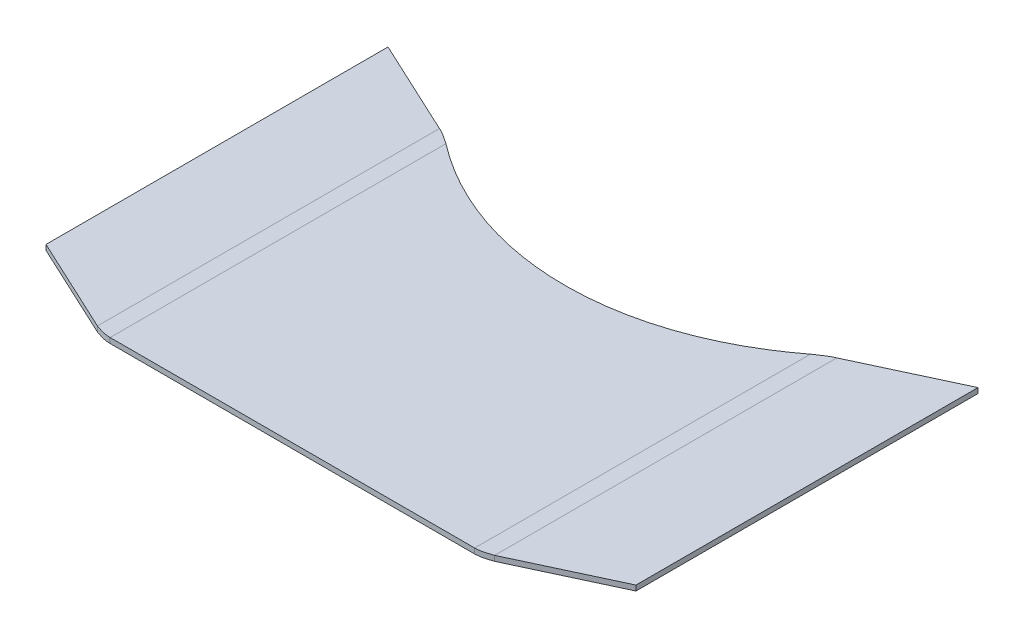
ISO-10303-21;
HEADER;
FILE_DESCRIPTION(('STEP AP214'),'2;1');
FILE_NAME('part.step','',(''),(''),'','','');
FILE_SCHEMA(('AUTOMOTIVE_DESIGN { 1 0 10303 214 1 1 1 1 }'));
ENDSEC;
DATA;
#1=APPLICATION_CONTEXT('core data for automotive mechanical design processes');
#2=APPLICATION_PROTOCOL_DEFINITION('international standard','automotive_design',2000,#1);
#3=PRODUCT_CONTEXT('',#1,'mechanical');
#4=PRODUCT('Part','Part','',(#3));
#5=PRODUCT_RELATED_PRODUCT_CATEGORY('part','',(#4));
#6=PRODUCT_DEFINITION_FORMATION('','',#4);
#7=PRODUCT_DEFINITION_CONTEXT('part definition',#1,'design');
#8=PRODUCT_DEFINITION('design','',#6,#7);
#9=PRODUCT_DEFINITION_SHAPE('','',#8);
#10=(LENGTH_UNIT() NAMED_UNIT(*) SI_UNIT(.MILLI.,.METRE.));
#11=(NAMED_UNIT(*) PLANE_ANGLE_UNIT() SI_UNIT($,.RADIAN.));
#12=(NAMED_UNIT(*) SI_UNIT($,.STERADIAN.) SOLID_ANGLE_UNIT());
#13=UNCERTAINTY_MEASURE_WITH_UNIT(LENGTH_MEASURE(1.E-05),#10,'distance_accuracy_value','');
#14=(GEOMETRIC_REPRESENTATION_CONTEXT(3) GLOBAL_UNCERTAINTY_ASSIGNED_CONTEXT((#13)) GLOBAL_UNIT_ASSIGNED_CONTEXT((#10,
#11,#12)) REPRESENTATION_CONTEXT('',''));
#15=CARTESIAN_POINT('',(0.,0.,0.));
#16=DIRECTION('',(0.,0.,1.));
#17=DIRECTION('',(1.,0.,0.));
#18=AXIS2_PLACEMENT_3D('',#15,#16,#17);
#19=CARTESIAN_POINT('',(0.,-20.,-89.5466140159563));
#20=DIRECTION('',(0.,1.,0.));
#21=DIRECTION('',(0.,0.,-1.));
#22=AXIS2_PLACEMENT_3D('',#19,#20,#21);
#23=ELLIPSE('',#22,134.887950593165,122.25);
#24=DIRECTION('',(0.,1.,0.));
#25=VECTOR('',#24,1.);
#26=SURFACE_OF_LINEAR_EXTRUSION('',#23,#25);
#27=CARTESIAN_POINT('',(70.,-22.,21.0395032780307));
#28=CARTESIAN_POINT('',(70.,-20.,21.0395032780307));
#29=B_SPLINE_CURVE_WITH_KNOTS('',1,(#27,#28),.UNSPECIFIED.,.F.,.F.,(2,2),(0.,1.),.UNSPECIFIED.);
#30=CARTESIAN_POINT('',(69.9999999999999,-22.,21.0395032780307));
#31=VERTEX_POINT('',#30);
#32=CARTESIAN_POINT('',(70.,-20.,21.0395032780307));
#33=VERTEX_POINT('',#32);
#34=EDGE_CURVE('E12',#31,#33,#29,.T.);
#35=ORIENTED_EDGE('',*,*,#34,.F.);
#36=CARTESIAN_POINT('',(0.,-22.,-89.5466140159563));
#37=DIRECTION('',(0.,1.,0.));
#38=DIRECTION('',(0.,0.,-1.));
#39=AXIS2_PLACEMENT_3D('',#36,#37,#38);
#40=ELLIPSE('',#39,134.887950593165,122.25);
#41=CARTESIAN_POINT('',(-70.,-22.,21.0395032780307));
#42=VERTEX_POINT('',#41);
#43=EDGE_CURVE('E82',#42,#31,#40,.T.);
#44=ORIENTED_EDGE('',*,*,#43,.F.);
#45=CARTESIAN_POINT('',(-70.,-22.,21.0395032780307));
#46=DIRECTION('',(0.,1.,0.));
#47=VECTOR('',#46,1.);
#48=LINE('',#45,#47);
#49=CARTESIAN_POINT('',(-70.,-20.,21.0395032780307));
#50=VERTEX_POINT('',#49);
#51=EDGE_CURVE('E568',#42,#50,#48,.T.);
#52=ORIENTED_EDGE('',*,*,#51,.T.);
#53=EDGE_CURVE('E408',#50,#33,#23,.T.);
#54=ORIENTED_EDGE('',*,*,#53,.T.);
#55=EDGE_LOOP('',(#35,#44,#52,#54));
#56=FACE_BOUND('',#55,.T.);
#57=ADVANCED_FACE('F65',(#56),#26,.F.);
#58=CARTESIAN_POINT('',(0.,-20.,150.));
#59=DIRECTION('',(0.,0.,1.));
#60=DIRECTION('',(1.,0.,0.));
#61=AXIS2_PLACEMENT_3D('',#58,#59,#60);
#62=PLANE('',#61);
#63=CARTESIAN_POINT('',(-70.,-22.,150.));
#64=CARTESIAN_POINT('',(-70.,-20.,150.));
#65=B_SPLINE_CURVE_WITH_KNOTS('',1,(#63,#64),.UNSPECIFIED.,.F.,.F.,(2,2),(0.,1.),.UNSPECIFIED.);
#66=CARTESIAN_POINT('',(-70.,-22.,150.));
#67=VERTEX_POINT('',#66);
#68=CARTESIAN_POINT('',(-70.,-20.,150.));
#69=VERTEX_POINT('',#68);
#70=EDGE_CURVE('E370',#67,#69,#65,.T.);
#71=ORIENTED_EDGE('',*,*,#70,.F.);
#72=DIRECTION('',(-1.,0.,0.));
#73=VECTOR('',#72,1.);
#74=CARTESIAN_POINT('',(0.,-22.,150.));
#75=LINE('',#74,#73);
#76=CARTESIAN_POINT('',(70.,-22.,150.));
#77=VERTEX_POINT('',#76);
#78=EDGE_CURVE('E90',#67,#77,#75,.F.);
#79=ORIENTED_EDGE('',*,*,#78,.T.);
#80=CARTESIAN_POINT('',(70.,-20.,150.));
#81=CARTESIAN_POINT('',(70.,-22.,150.));
#82=B_SPLINE_CURVE_WITH_KNOTS('',1,(#80,#81),.UNSPECIFIED.,.F.,.F.,(2,2),(0.,1.),.UNSPECIFIED.);
#83=CARTESIAN_POINT('',(70.,-20.,150.));
#84=VERTEX_POINT('',#83);
#85=EDGE_CURVE('E293',#77,#84,#82,.F.);
#86=ORIENTED_EDGE('',*,*,#85,.T.);
#87=DIRECTION('',(1.,0.,0.));
#88=VECTOR('',#87,1.);
#89=CARTESIAN_POINT('',(0.,-20.,150.));
#90=LINE('',#89,#88);
#91=EDGE_CURVE('E560',#69,#84,#90,.T.);
#92=ORIENTED_EDGE('',*,*,#91,.F.);
#93=EDGE_LOOP('',(#71,#79,#86,#92));
#94=FACE_BOUND('',#93,.T.);
#95=ADVANCED_FACE('F383',(#94),#62,.T.);
#96=CARTESIAN_POINT('',(0.,-20.,150.));
#97=DIRECTION('',(0.,1.,0.));
#98=DIRECTION('',(-1.,0.,0.));
#99=AXIS2_PLACEMENT_3D('',#96,#97,#98);
#100=PLANE('',#99);
#101=ORIENTED_EDGE('',*,*,#53,.F.);
#102=DIRECTION('',(0.,0.,1.));
#103=VECTOR('',#102,1.);
#104=CARTESIAN_POINT('',(-70.,-20.,150.));
#105=LINE('',#104,#103);
#106=EDGE_CURVE('E581',#50,#69,#105,.T.);
#107=ORIENTED_EDGE('',*,*,#106,.T.);
#108=ORIENTED_EDGE('',*,*,#91,.T.);
#109=DIRECTION('',(0.,0.,-1.));
#110=VECTOR('',#109,1.);
#111=CARTESIAN_POINT('',(70.,-20.,150.));
#112=LINE('',#111,#110);
#113=EDGE_CURVE('E368',#84,#33,#112,.T.);
#114=ORIENTED_EDGE('',*,*,#113,.T.);
#115=EDGE_LOOP('',(#101,#107,#108,#114));
#116=FACE_BOUND('',#115,.T.);
#117=ADVANCED_FACE('F392',(#116),#100,.T.);
#118=CARTESIAN_POINT('',(0.,-22.,150.));
#119=DIRECTION('',(0.,1.,0.));
#120=DIRECTION('',(-1.,0.,0.));
#121=AXIS2_PLACEMENT_3D('',#118,#119,#120);
#122=PLANE('',#121);
#123=ORIENTED_EDGE('',*,*,#43,.T.);
#124=DIRECTION('',(0.,0.,-1.));
#125=VECTOR('',#124,1.);
#126=CARTESIAN_POINT('',(70.,-22.,150.));
#127=LINE('',#126,#125);
#128=EDGE_CURVE('E75',#77,#31,#127,.T.);
#129=ORIENTED_EDGE('',*,*,#128,.F.);
#130=ORIENTED_EDGE('',*,*,#78,.F.);
#131=DIRECTION('',(0.,0.,1.));
#132=VECTOR('',#131,1.);
#133=CARTESIAN_POINT('',(-70.,-22.,150.));
#134=LINE('',#133,#132);
#135=EDGE_CURVE('E590',#42,#67,#134,.T.);
#136=ORIENTED_EDGE('',*,*,#135,.F.);
#137=EDGE_LOOP('',(#123,#129,#130,#136));
#138=FACE_BOUND('',#137,.T.);
#139=ADVANCED_FACE('F393',(#138),#122,.F.);
#140=CARTESIAN_POINT('',(-76.2831853071796,-20.,148.601077025535));
#141=CARTESIAN_POINT('',(-75.6027606301396,-20.,148.838998495694));
#142=CARTESIAN_POINT('',(-75.0055883654543,-20.,149.039169808946));
#143=CARTESIAN_POINT('',(-74.2347085869583,-20.,149.282801543462));
#144=CARTESIAN_POINT('',(-73.9985617638817,-20.,149.354574582407));
#145=CARTESIAN_POINT('',(-73.6755611838998,-20.,149.448077831984));
#146=CARTESIAN_POINT('',(-73.573097599678,-20.,149.476886197036));
#147=CARTESIAN_POINT('',(-73.4272071370035,-20.,149.516559667404));
#148=CARTESIAN_POINT('',(-73.3798778017218,-20.,149.529194311326));
#149=CARTESIAN_POINT('',(-73.3108350272137,-20.,149.547261507905));
#150=CARTESIAN_POINT('',(-73.2881459737801,-20.,149.553136445214));
#151=CARTESIAN_POINT('',(-73.2546002007333,-20.,149.561727658852));
#152=CARTESIAN_POINT('',(-73.2434995775683,-20.,149.564554531344));
#153=CARTESIAN_POINT('',(-73.2269705945968,-20.,149.568739542));
#154=CARTESIAN_POINT('',(-73.2214812589022,-20.,149.570125329206));
#155=CARTESIAN_POINT('',(-73.2132777433044,-20.,149.572190185493));
#156=CARTESIAN_POINT('',(-73.2105483194291,-20.,149.572876166836));
#157=CARTESIAN_POINT('',(-73.2050996343265,-20.,149.574243521347));
#158=CARTESIAN_POINT('',(-73.2037635497755,-20.,149.574578833256));
#159=CARTESIAN_POINT('',(-72.1507429088439,-20.,149.838037331112));
#160=CARTESIAN_POINT('',(-71.0841875111119,-20.,149.97950267658));
#161=CARTESIAN_POINT('',(-70.,-20.,150.));
#162=CARTESIAN_POINT('',(-76.2831853071796,-22.,148.601077025535));
#163=CARTESIAN_POINT('',(-75.6027606301396,-22.,148.838998495694));
#164=CARTESIAN_POINT('',(-75.0055883654543,-22.,149.039169808946));
#165=CARTESIAN_POINT('',(-74.2347085869583,-22.,149.282801543462));
#166=CARTESIAN_POINT('',(-73.9985617638817,-22.,149.354574582407));
#167=CARTESIAN_POINT('',(-73.6755611838998,-22.,149.448077831984));
#168=CARTESIAN_POINT('',(-73.573097599678,-22.,149.476886197036));
#169=CARTESIAN_POINT('',(-73.4272071370035,-22.,149.516559667404));
#170=CARTESIAN_POINT('',(-73.3798778017218,-22.,149.529194311326));
#171=CARTESIAN_POINT('',(-73.3108350272137,-22.,149.547261507905));
#172=CARTESIAN_POINT('',(-73.2881459737801,-22.,149.553136445214));
#173=CARTESIAN_POINT('',(-73.2546002007333,-22.,149.561727658852));
#174=CARTESIAN_POINT('',(-73.2434995775683,-22.,149.564554531344));
#175=CARTESIAN_POINT('',(-73.2269705945968,-22.,149.568739542));
#176=CARTESIAN_POINT('',(-73.2214812589022,-22.,149.570125329206));
#177=CARTESIAN_POINT('',(-73.2132777433044,-22.,149.572190185493));
#178=CARTESIAN_POINT('',(-73.2105483194291,-22.,149.572876166836));
#179=CARTESIAN_POINT('',(-73.2050996343265,-22.,149.574243521347));
#180=CARTESIAN_POINT('',(-73.2037635497755,-22.,149.574578833256));
#181=CARTESIAN_POINT('',(-72.1507429088439,-22.,149.838037331112));
#182=CARTESIAN_POINT('',(-71.0841875111119,-22.,149.97950267658));
#183=CARTESIAN_POINT('',(-70.,-22.,150.));
#184=B_SPLINE_SURFACE_WITH_KNOTS('',1,3,((#140,#141,#142,#143,#144,#145,#146,#147,#148,#149,
#150,#151,#152,#153,#154,#155,#156,#157,#158,#159,#160,#161),(#162,#163,#164,#165,#166,#167,
#168,#169,#170,#171,#172,#173,#174,#175,#176,#177,#178,#179,#180,#181,#182,#183)),.UNSPECIFIED.,
.F.,.F.,.F.,(2,2),(4,2,2,2,2,2,2,2,2,2,4),(0.,1.),(0.,0.25,0.375,0.4375,0.46875,0.484375,
0.4921875,0.49609375,0.498046875,0.5,1.),.UNSPECIFIED.);
#185=CARTESIAN_POINT('',(-76.2831853071796,-20.,148.601077025535));
#186=CARTESIAN_POINT('',(-76.2831853071796,-22.,148.601077025535));
#187=B_SPLINE_CURVE_WITH_KNOTS('',1,(#185,#186),.UNSPECIFIED.,.F.,.F.,(2,2),(0.,1.),.UNSPECIFIED.);
#188=CARTESIAN_POINT('',(-76.2831853071796,-22.,148.601077025535));
#189=VERTEX_POINT('',#188);
#190=CARTESIAN_POINT('',(-76.2831853071796,-20.,148.601077025535));
#191=VERTEX_POINT('',#190);
#192=EDGE_CURVE('E365',#189,#191,#187,.F.);
#193=CARTESIAN_POINT('',(-76.2831853071796,-22.,148.601077025535));
#194=CARTESIAN_POINT('',(-75.6027606301396,-22.,148.838998495694));
#195=CARTESIAN_POINT('',(-75.0055883654543,-22.,149.039169808946));
#196=CARTESIAN_POINT('',(-74.2347085869583,-22.,149.282801543462));
#197=CARTESIAN_POINT('',(-73.9985617638817,-22.,149.354574582407));
#198=CARTESIAN_POINT('',(-73.6755611838998,-22.,149.448077831984));
#199=CARTESIAN_POINT('',(-73.573097599678,-22.,149.476886197036));
#200=CARTESIAN_POINT('',(-73.4272071370035,-22.,149.516559667404));
#201=CARTESIAN_POINT('',(-73.3798778017218,-22.,149.529194311326));
#202=CARTESIAN_POINT('',(-73.3108350272137,-22.,149.547261507905));
#203=CARTESIAN_POINT('',(-73.2881459737801,-22.,149.553136445214));
#204=CARTESIAN_POINT('',(-73.2546002007333,-22.,149.561727658852));
#205=CARTESIAN_POINT('',(-73.2434995775683,-22.,149.564554531344));
#206=CARTESIAN_POINT('',(-73.2269705945968,-22.,149.568739542));
#207=CARTESIAN_POINT('',(-73.2214812589022,-22.,149.570125329206));
#208=CARTESIAN_POINT('',(-73.2132777433044,-22.,149.572190185493));
#209=CARTESIAN_POINT('',(-73.2105483194291,-22.,149.572876166836));
#210=CARTESIAN_POINT('',(-73.2050996343265,-22.,149.574243521347));
#211=CARTESIAN_POINT('',(-73.2037635497755,-22.,149.574578833256));
#212=CARTESIAN_POINT('',(-72.1507429088439,-22.,149.838037331112));
#213=CARTESIAN_POINT('',(-71.0841875111119,-22.,149.97950267658));
#214=CARTESIAN_POINT('',(-70.,-22.,150.));
#215=B_SPLINE_CURVE_WITH_KNOTS('',3,(#193,#194,#195,#196,#197,#198,#199,#200,#201,#202,#203,
#204,#205,#206,#207,#208,#209,#210,#211,#212,#213,#214),.UNSPECIFIED.,.F.,.F.,(4,2,2,2,2,2,2,2,
2,2,4),(0.,0.25,0.375,0.4375,0.46875,0.484375,0.4921875,0.49609375,0.498046875,0.5,1.),.UNSPECIFIED.);
#216=EDGE_CURVE('E364',#189,#67,#215,.T.);
#217=CARTESIAN_POINT('',(-70.,-20.,150.));
#218=CARTESIAN_POINT('',(-71.0841875111119,-20.,149.97950267658));
#219=CARTESIAN_POINT('',(-72.1507429088439,-20.,149.838037331112));
#220=CARTESIAN_POINT('',(-73.2037635497755,-20.,149.574578833256));
#221=CARTESIAN_POINT('',(-73.2050996343265,-20.,149.574243521347));
#222=CARTESIAN_POINT('',(-73.2105483194291,-20.,149.572876166836));
#223=CARTESIAN_POINT('',(-73.2132777433044,-20.,149.572190185493));
#224=CARTESIAN_POINT('',(-73.2214812589022,-20.,149.570125329206));
#225=CARTESIAN_POINT('',(-73.2269705945968,-20.,149.568739542));
#226=CARTESIAN_POINT('',(-73.2434995775683,-20.,149.564554531344));
#227=CARTESIAN_POINT('',(-73.2546002007333,-20.,149.561727658852));
#228=CARTESIAN_POINT('',(-73.2881459737801,-20.,149.553136445214));
#229=CARTESIAN_POINT('',(-73.3108350272137,-20.,149.547261507905));
#230=CARTESIAN_POINT('',(-73.3798778017218,-20.,149.529194311326));
#231=CARTESIAN_POINT('',(-73.4272071370035,-20.,149.516559667404));
#232=CARTESIAN_POINT('',(-73.573097599678,-20.,149.476886197036));
#233=CARTESIAN_POINT('',(-73.6755611838998,-20.,149.448077831984));
#234=CARTESIAN_POINT('',(-73.9985617638817,-20.,149.354574582407));
#235=CARTESIAN_POINT('',(-74.2347085869583,-20.,149.282801543462));
#236=CARTESIAN_POINT('',(-75.0055883654543,-20.,149.039169808946));
#237=CARTESIAN_POINT('',(-75.6027606301396,-20.,148.838998495694));
#238=CARTESIAN_POINT('',(-76.2831853071796,-20.,148.601077025535));
#239=B_SPLINE_CURVE_WITH_KNOTS('',3,(#217,#218,#219,#220,#221,#222,#223,#224,#225,#226,#227,
#228,#229,#230,#231,#232,#233,#234,#235,#236,#237,#238),.UNSPECIFIED.,.F.,.F.,(4,2,2,2,2,2,2,2,
2,2,4),(0.,0.5,0.501953125,0.50390625,0.5078125,0.515625,0.53125,0.5625,0.625,0.75,1.),.UNSPECIFIED.);
#240=EDGE_CURVE('E499',#191,#69,#239,.F.);
#241=ORIENTED_EDGE('',*,*,#192,.F.);
#242=ORIENTED_EDGE('',*,*,#216,.T.);
#243=ORIENTED_EDGE('',*,*,#70,.T.);
#244=ORIENTED_EDGE('',*,*,#240,.F.);
#245=EDGE_LOOP('',(#241,#242,#243,#244));
#246=FACE_BOUND('',#245,.T.);
#247=ADVANCED_FACE('F505',(#246),#184,.T.);
#248=CARTESIAN_POINT('',(-70.,-20.,21.0395032780307));
#249=CARTESIAN_POINT('',(-70.1939429668135,-20.,20.9238259443564));
#250=CARTESIAN_POINT('',(-70.5462949043356,-20.,20.6968372163103));
#251=CARTESIAN_POINT('',(-71.3124362666817,-20.,20.1893870326838));
#252=CARTESIAN_POINT('',(-71.6074189634742,-20.,19.992409122882));
#253=CARTESIAN_POINT('',(-72.1092963726786,-20.,19.6552004852899));
#254=CARTESIAN_POINT('',(-72.2864894030827,-20.,19.5358406439444));
#255=CARTESIAN_POINT('',(-72.5671297896928,-20.,19.3463654387036));
#256=CARTESIAN_POINT('',(-72.6631517253968,-20.,19.2814677964197));
#257=CARTESIAN_POINT('',(-72.8108973392038,-20.,19.1815124721881));
#258=CARTESIAN_POINT('',(-72.8607646621814,-20.,19.1477592206434));
#259=CARTESIAN_POINT('',(-72.9364938242103,-20.,19.0964771281248));
#260=CARTESIAN_POINT('',(-72.9618915744805,-20.,19.0792743947517));
#261=CARTESIAN_POINT('',(-73.0002202442763,-20.,19.0533072408918));
#262=CARTESIAN_POINT('',(-73.0130351416067,-20.,19.044624347305));
#263=CARTESIAN_POINT('',(-73.0323154987,-20.,19.0315592434749));
#264=CARTESIAN_POINT('',(-73.0387519529141,-20.,19.0271974149565));
#265=CARTESIAN_POINT('',(-73.0516441983747,-20.,19.018460170103));
#266=CARTESIAN_POINT('',(-73.0596791968512,-20.,19.0130143862529));
#267=CARTESIAN_POINT('',(-74.3154460978264,-20.,18.1618708050286));
#268=CARTESIAN_POINT('',(-75.3883193837582,-20.,17.5764310744322));
#269=CARTESIAN_POINT('',(-76.2831853071796,-20.,17.253383351735));
#270=CARTESIAN_POINT('',(-70.,-22.,21.0395032780307));
#271=CARTESIAN_POINT('',(-70.1939429668135,-22.,20.9238259443564));
#272=CARTESIAN_POINT('',(-70.5462949043356,-22.,20.6968372163103));
#273=CARTESIAN_POINT('',(-71.3124362666817,-22.,20.1893870326838));
#274=CARTESIAN_POINT('',(-71.6074189634742,-22.,19.992409122882));
#275=CARTESIAN_POINT('',(-72.1092963726786,-22.,19.6552004852899));
#276=CARTESIAN_POINT('',(-72.2864894030827,-22.,19.5358406439444));
#277=CARTESIAN_POINT('',(-72.5671297896928,-22.,19.3463654387036));
#278=CARTESIAN_POINT('',(-72.6631517253968,-22.,19.2814677964197));
#279=CARTESIAN_POINT('',(-72.8108973392038,-22.,19.1815124721881));
#280=CARTESIAN_POINT('',(-72.8607646621814,-22.,19.1477592206434));
#281=CARTESIAN_POINT('',(-72.9364938242103,-22.,19.0964771281248));
#282=CARTESIAN_POINT('',(-72.9618915744805,-22.,19.0792743947517));
#283=CARTESIAN_POINT('',(-73.0002202442763,-22.,19.0533072408918));
#284=CARTESIAN_POINT('',(-73.0130351416067,-22.,19.044624347305));
#285=CARTESIAN_POINT('',(-73.0323154987,-22.,19.0315592434749));
#286=CARTESIAN_POINT('',(-73.0387519529141,-22.,19.0271974149565));
#287=CARTESIAN_POINT('',(-73.0516441983747,-22.,19.018460170103));
#288=CARTESIAN_POINT('',(-73.0596791968512,-22.,19.0130143862529));
#289=CARTESIAN_POINT('',(-74.3154460978264,-22.,18.1618708050286));
#290=CARTESIAN_POINT('',(-75.3883193837582,-22.,17.5764310744322));
#291=CARTESIAN_POINT('',(-76.2831853071796,-22.,17.253383351735));
#292=B_SPLINE_SURFACE_WITH_KNOTS('',1,3,((#248,#249,#250,#251,#252,#253,#254,#255,#256,#257,
#258,#259,#260,#261,#262,#263,#264,#265,#266,#267,#268,#269),(#270,#271,#272,#273,#274,#275,
#276,#277,#278,#279,#280,#281,#282,#283,#284,#285,#286,#287,#288,#289,#290,#291)),.UNSPECIFIED.,
.F.,.F.,.F.,(2,2),(4,2,2,2,2,2,2,2,2,2,4),(0.,1.),(0.,0.25,0.375,0.4375,0.46875,0.484375,
0.4921875,0.49609375,0.498046875,0.5,1.),.UNSPECIFIED.);
#293=CARTESIAN_POINT('',(-70.,-22.,21.0395032780307));
#294=CARTESIAN_POINT('',(-70.1939429668135,-22.,20.9238259443564));
#295=CARTESIAN_POINT('',(-70.5462949043356,-22.,20.6968372163103));
#296=CARTESIAN_POINT('',(-71.3124362666817,-22.,20.1893870326838));
#297=CARTESIAN_POINT('',(-71.6074189634742,-22.,19.992409122882));
#298=CARTESIAN_POINT('',(-72.1092963726786,-22.,19.6552004852899));
#299=CARTESIAN_POINT('',(-72.2864894030827,-22.,19.5358406439444));
#300=CARTESIAN_POINT('',(-72.5671297896928,-22.,19.3463654387036));
#301=CARTESIAN_POINT('',(-72.6631517253968,-22.,19.2814677964197));
#302=CARTESIAN_POINT('',(-72.8108973392038,-22.,19.1815124721881));
#303=CARTESIAN_POINT('',(-72.8607646621814,-22.,19.1477592206434));
#304=CARTESIAN_POINT('',(-72.9364938242103,-22.,19.0964771281248));
#305=CARTESIAN_POINT('',(-72.9618915744805,-22.,19.0792743947517));
#306=CARTESIAN_POINT('',(-73.0002202442763,-22.,19.0533072408918));
#307=CARTESIAN_POINT('',(-73.0130351416067,-22.,19.044624347305));
#308=CARTESIAN_POINT('',(-73.0323154987,-22.,19.0315592434749));
#309=CARTESIAN_POINT('',(-73.0387519529141,-22.,19.0271974149565));
#310=CARTESIAN_POINT('',(-73.0516441983747,-22.,19.018460170103));
#311=CARTESIAN_POINT('',(-73.0596791968512,-22.,19.0130143862529));
#312=CARTESIAN_POINT('',(-74.3154460978264,-22.,18.1618708050286));
#313=CARTESIAN_POINT('',(-75.3883193837582,-22.,17.5764310744322));
#314=CARTESIAN_POINT('',(-76.2831853071796,-22.,17.253383351735));
#315=B_SPLINE_CURVE_WITH_KNOTS('',3,(#293,#294,#295,#296,#297,#298,#299,#300,#301,#302,#303,
#304,#305,#306,#307,#308,#309,#310,#311,#312,#313,#314),.UNSPECIFIED.,.F.,.F.,(4,2,2,2,2,2,2,2,
2,2,4),(0.,0.25,0.375,0.4375,0.46875,0.484375,0.4921875,0.49609375,0.498046875,0.5,1.),.UNSPECIFIED.);
#316=CARTESIAN_POINT('',(-76.2831853071796,-22.,17.253383351735));
#317=VERTEX_POINT('',#316);
#318=EDGE_CURVE('E461',#42,#317,#315,.T.);
#319=CARTESIAN_POINT('',(-76.2831853071796,-22.,17.253383351735));
#320=CARTESIAN_POINT('',(-76.2831853071796,-20.,17.253383351735));
#321=B_SPLINE_CURVE_WITH_KNOTS('',1,(#319,#320),.UNSPECIFIED.,.F.,.F.,(2,2),(0.,1.),.UNSPECIFIED.);
#322=CARTESIAN_POINT('',(-76.2831853071796,-20.,17.253383351735));
#323=VERTEX_POINT('',#322);
#324=EDGE_CURVE('E320',#317,#323,#321,.T.);
#325=CARTESIAN_POINT('',(-76.2831853071796,-20.,17.253383351735));
#326=CARTESIAN_POINT('',(-75.3883193837582,-20.,17.5764310744322));
#327=CARTESIAN_POINT('',(-74.3154460978264,-20.,18.1618708050286));
#328=CARTESIAN_POINT('',(-73.0596791968512,-20.,19.0130143862529));
#329=CARTESIAN_POINT('',(-73.0516441983747,-20.,19.018460170103));
#330=CARTESIAN_POINT('',(-73.0387519529141,-20.,19.0271974149565));
#331=CARTESIAN_POINT('',(-73.0323154987,-20.,19.0315592434749));
#332=CARTESIAN_POINT('',(-73.0130351416067,-20.,19.044624347305));
#333=CARTESIAN_POINT('',(-73.0002202442763,-20.,19.0533072408918));
#334=CARTESIAN_POINT('',(-72.9618915744805,-20.,19.0792743947517));
#335=CARTESIAN_POINT('',(-72.9364938242103,-20.,19.0964771281248));
#336=CARTESIAN_POINT('',(-72.8607646621814,-20.,19.1477592206434));
#337=CARTESIAN_POINT('',(-72.8108973392038,-20.,19.1815124721881));
#338=CARTESIAN_POINT('',(-72.6631517253968,-20.,19.2814677964197));
#339=CARTESIAN_POINT('',(-72.5671297896928,-20.,19.3463654387036));
#340=CARTESIAN_POINT('',(-72.2864894030827,-20.,19.5358406439444));
#341=CARTESIAN_POINT('',(-72.1092963726786,-20.,19.6552004852899));
#342=CARTESIAN_POINT('',(-71.6074189634742,-20.,19.992409122882));
#343=CARTESIAN_POINT('',(-71.3124362666817,-20.,20.1893870326838));
#344=CARTESIAN_POINT('',(-70.5462949043356,-20.,20.6968372163103));
#345=CARTESIAN_POINT('',(-70.1939429668135,-20.,20.9238259443564));
#346=CARTESIAN_POINT('',(-70.,-20.,21.0395032780307));
#347=B_SPLINE_CURVE_WITH_KNOTS('',3,(#325,#326,#327,#328,#329,#330,#331,#332,#333,#334,#335,
#336,#337,#338,#339,#340,#341,#342,#343,#344,#345,#346),.UNSPECIFIED.,.F.,.F.,(4,2,2,2,2,2,2,2,
2,2,4),(0.,0.5,0.501953125,0.50390625,0.5078125,0.515625,0.53125,0.5625,0.625,0.75,1.),.UNSPECIFIED.);
#348=EDGE_CURVE('E456',#50,#323,#347,.F.);
#349=ORIENTED_EDGE('',*,*,#51,.F.);
#350=ORIENTED_EDGE('',*,*,#318,.T.);
#351=ORIENTED_EDGE('',*,*,#324,.T.);
#352=ORIENTED_EDGE('',*,*,#348,.F.);
#353=EDGE_LOOP('',(#349,#350,#351,#352));
#354=FACE_BOUND('',#353,.T.);
#355=ADVANCED_FACE('F475',(#354),#292,.T.);
#356=CARTESIAN_POINT('',(-73.1415926535898,-20.,85.5197516390153));
#357=DIRECTION('',(0.,1.,0.));
#358=DIRECTION('',(-1.,0.,0.));
#359=AXIS2_PLACEMENT_3D('',#356,#357,#358);
#360=PLANE('',#359);
#361=ORIENTED_EDGE('',*,*,#348,.T.);
#362=DIRECTION('',(0.,0.,-1.));
#363=VECTOR('',#362,1.);
#364=CARTESIAN_POINT('',(-76.2831853071796,-20.,18.6523063262));
#365=LINE('',#364,#363);
#366=EDGE_CURVE('E423',#191,#323,#365,.T.);
#367=ORIENTED_EDGE('',*,*,#366,.F.);
#368=ORIENTED_EDGE('',*,*,#240,.T.);
#369=ORIENTED_EDGE('',*,*,#106,.F.);
#370=EDGE_LOOP('',(#361,#367,#368,#369));
#371=FACE_BOUND('',#370,.T.);
#372=ADVANCED_FACE('F346',(#371),#360,.T.);
#373=CARTESIAN_POINT('',(-73.1415926535898,-22.,85.5197516390153));
#374=DIRECTION('',(0.,1.,0.));
#375=DIRECTION('',(-1.,0.,0.));
#376=AXIS2_PLACEMENT_3D('',#373,#374,#375);
#377=PLANE('',#376);
#378=ORIENTED_EDGE('',*,*,#318,.F.);
#379=ORIENTED_EDGE('',*,*,#135,.T.);
#380=ORIENTED_EDGE('',*,*,#216,.F.);
#381=DIRECTION('',(0.,0.,-1.));
#382=VECTOR('',#381,1.);
#383=CARTESIAN_POINT('',(-76.2831853071796,-22.,150.));
#384=LINE('',#383,#382);
#385=EDGE_CURVE('E436',#189,#317,#384,.T.);
#386=ORIENTED_EDGE('',*,*,#385,.T.);
#387=EDGE_LOOP('',(#378,#379,#380,#386));
#388=FACE_BOUND('',#387,.T.);
#389=ADVANCED_FACE('F466',(#388),#377,.F.);
#390=CARTESIAN_POINT('',(-113.28318530718,-20.,150.));
#391=DIRECTION('',(1.,0.,0.));
#392=DIRECTION('',(0.,0.,-1.));
#393=AXIS2_PLACEMENT_3D('',#390,#391,#392);
#394=PLANE('',#393);
#395=DIRECTION('',(0.,1.,0.));
#396=VECTOR('',#395,1.);
#397=CARTESIAN_POINT('',(-113.28318530718,-20.,0.));
#398=LINE('',#397,#396);
#399=CARTESIAN_POINT('',(-113.28318530718,-22.,0.));
#400=VERTEX_POINT('',#399);
#401=CARTESIAN_POINT('',(-113.28318530718,-20.,0.));
#402=VERTEX_POINT('',#401);
#403=EDGE_CURVE('E420',#400,#402,#398,.T.);
#404=ORIENTED_EDGE('',*,*,#403,.F.);
#405=DIRECTION('',(0.,0.,-1.));
#406=VECTOR('',#405,1.);
#407=CARTESIAN_POINT('',(-113.28318530718,-22.,150.));
#408=LINE('',#407,#406);
#409=CARTESIAN_POINT('',(-113.28318530718,-22.,131.3476936738));
#410=VERTEX_POINT('',#409);
#411=EDGE_CURVE('E413',#410,#400,#408,.T.);
#412=ORIENTED_EDGE('',*,*,#411,.F.);
#413=DIRECTION('',(0.,1.,0.));
#414=VECTOR('',#413,1.);
#415=CARTESIAN_POINT('',(-113.28318530718,-20.,131.3476936738));
#416=LINE('',#415,#414);
#417=CARTESIAN_POINT('',(-113.28318530718,-20.,131.3476936738));
#418=VERTEX_POINT('',#417);
#419=EDGE_CURVE('E434',#410,#418,#416,.T.);
#420=ORIENTED_EDGE('',*,*,#419,.T.);
#421=DIRECTION('',(0.,0.,-1.));
#422=VECTOR('',#421,1.);
#423=CARTESIAN_POINT('',(-113.28318530718,-20.,150.));
#424=LINE('',#423,#422);
#425=EDGE_CURVE('E429',#418,#402,#424,.T.);
#426=ORIENTED_EDGE('',*,*,#425,.T.);
#427=EDGE_LOOP('',(#404,#412,#420,#426));
#428=FACE_BOUND('',#427,.T.);
#429=ADVANCED_FACE('F268',(#428),#394,.F.);
#430=CARTESIAN_POINT('',(-93.2831853071796,-20.,150.));
#431=DIRECTION('',(0.,1.,0.));
#432=DIRECTION('',(0.,0.,-1.));
#433=AXIS2_PLACEMENT_3D('',#430,#431,#432);
#434=PLANE('',#433);
#435=DIRECTION('',(-0.90630778703665,0.,-0.4226182617407));
#436=VECTOR('',#435,1.);
#437=CARTESIAN_POINT('',(-89.711061404045,-20.,142.33955556881));
#438=LINE('',#437,#436);
#439=EDGE_CURVE('E356',#191,#418,#438,.T.);
#440=ORIENTED_EDGE('',*,*,#439,.F.);
#441=ORIENTED_EDGE('',*,*,#366,.T.);
#442=DIRECTION('',(-0.906307787036649,0.,-0.4226182617407));
#443=VECTOR('',#442,1.);
#444=CARTESIAN_POINT('',(-21.3313122698389,-20.,42.8778625790082));
#445=LINE('',#444,#443);
#446=EDGE_CURVE('E414',#402,#323,#445,.F.);
#447=ORIENTED_EDGE('',*,*,#446,.F.);
#448=ORIENTED_EDGE('',*,*,#425,.F.);
#449=EDGE_LOOP('',(#440,#441,#447,#448));
#450=FACE_BOUND('',#449,.T.);
#451=ADVANCED_FACE('F338',(#450),#434,.T.);
#452=CARTESIAN_POINT('',(-21.3313122698389,-20.,42.8778625790082));
#453=DIRECTION('',(0.4226182617407,0.,-0.90630778703665));
#454=DIRECTION('',(-0.906307787036649,0.,-0.4226182617407));
#455=AXIS2_PLACEMENT_3D('',#452,#453,#454);
#456=PLANE('',#455);
#457=ORIENTED_EDGE('',*,*,#324,.F.);
#458=DIRECTION('',(-0.906307787036649,0.,-0.4226182617407));
#459=VECTOR('',#458,1.);
#460=CARTESIAN_POINT('',(-21.3313122698389,-22.,42.8778625790082));
#461=LINE('',#460,#459);
#462=EDGE_CURVE('E326',#400,#317,#461,.F.);
#463=ORIENTED_EDGE('',*,*,#462,.F.);
#464=ORIENTED_EDGE('',*,*,#403,.T.);
#465=ORIENTED_EDGE('',*,*,#446,.T.);
#466=EDGE_LOOP('',(#457,#463,#464,#465));
#467=FACE_BOUND('',#466,.T.);
#468=ADVANCED_FACE('F328',(#467),#456,.T.);
#469=CARTESIAN_POINT('',(-93.2831853071796,-22.,150.));
#470=DIRECTION('',(0.,1.,0.));
#471=DIRECTION('',(0.,0.,-1.));
#472=AXIS2_PLACEMENT_3D('',#469,#470,#471);
#473=PLANE('',#472);
#474=DIRECTION('',(-0.90630778703665,0.,-0.4226182617407));
#475=VECTOR('',#474,1.);
#476=CARTESIAN_POINT('',(-89.711061404045,-22.,142.33955556881));
#477=LINE('',#476,#475);
#478=EDGE_CURVE('E411',#189,#410,#477,.T.);
#479=ORIENTED_EDGE('',*,*,#478,.T.);
#480=ORIENTED_EDGE('',*,*,#411,.T.);
#481=ORIENTED_EDGE('',*,*,#462,.T.);
#482=ORIENTED_EDGE('',*,*,#385,.F.);
#483=EDGE_LOOP('',(#479,#480,#481,#482));
#484=FACE_BOUND('',#483,.T.);
#485=ADVANCED_FACE('F337',(#484),#473,.F.);
#486=CARTESIAN_POINT('',(-89.711061404045,-20.,142.33955556881));
#487=DIRECTION('',(0.4226182617407,0.,-0.90630778703665));
#488=DIRECTION('',(-0.90630778703665,0.,-0.4226182617407));
#489=AXIS2_PLACEMENT_3D('',#486,#487,#488);
#490=PLANE('',#489);
#491=ORIENTED_EDGE('',*,*,#419,.F.);
#492=ORIENTED_EDGE('',*,*,#478,.F.);
#493=ORIENTED_EDGE('',*,*,#192,.T.);
#494=ORIENTED_EDGE('',*,*,#439,.T.);
#495=EDGE_LOOP('',(#491,#492,#493,#494));
#496=FACE_BOUND('',#495,.T.);
#497=ADVANCED_FACE('F264',(#496),#490,.F.);
#498=CARTESIAN_POINT('',(70.,-20.,150.));
#499=CARTESIAN_POINT('',(70.5866815802702,-20.,149.978993938807));
#500=CARTESIAN_POINT('',(71.1466736287773,-20.,149.933086573079));
#501=CARTESIAN_POINT('',(71.9466274038932,-20.,149.826873567685));
#502=CARTESIAN_POINT('',(72.2066062793243,-20.,149.78524390642));
#503=CARTESIAN_POINT('',(72.5865660180599,-20.,149.713461425322));
#504=CARTESIAN_POINT('',(72.7115511685699,-20.,149.687977600089));
#505=CARTESIAN_POINT('',(72.8965267507321,-20.,149.64741736494));
#506=CARTESIAN_POINT('',(72.9577682541857,-20.,149.633508203673));
#507=CARTESIAN_POINT('',(73.0490049734654,-20.,149.612060837449));
#508=CARTESIAN_POINT('',(73.0793129572419,-20.,149.604814444653));
#509=CARTESIAN_POINT('',(73.1246185489314,-20.,149.593798949378));
#510=CARTESIAN_POINT('',(73.139694348832,-20.,149.590102799939));
#511=CARTESIAN_POINT('',(73.1622689526891,-20.,149.584522099261));
#512=CARTESIAN_POINT('',(73.1697873046426,-20.,149.582655786282));
#513=CARTESIAN_POINT('',(73.1848109765515,-20.,149.578911001483));
#514=CARTESIAN_POINT('',(73.1943047196827,-20.,149.576532811924));
#515=CARTESIAN_POINT('',(73.9051438404079,-20.,149.397889290389));
#516=CARTESIAN_POINT('',(74.9329339093133,-20.,149.073198972759));
#517=CARTESIAN_POINT('',(76.2831853071796,-20.,148.601077025535));
#518=CARTESIAN_POINT('',(70.,-22.,150.));
#519=CARTESIAN_POINT('',(70.5866815802702,-22.,149.978993938807));
#520=CARTESIAN_POINT('',(71.1466736287773,-22.,149.933086573079));
#521=CARTESIAN_POINT('',(71.9466274038932,-22.,149.826873567685));
#522=CARTESIAN_POINT('',(72.2066062793243,-22.,149.78524390642));
#523=CARTESIAN_POINT('',(72.5865660180599,-22.,149.713461425322));
#524=CARTESIAN_POINT('',(72.7115511685699,-22.,149.687977600089));
#525=CARTESIAN_POINT('',(72.8965267507321,-22.,149.64741736494));
#526=CARTESIAN_POINT('',(72.9577682541857,-22.,149.633508203673));
#527=CARTESIAN_POINT('',(73.0490049734654,-22.,149.612060837449));
#528=CARTESIAN_POINT('',(73.0793129572419,-22.,149.604814444653));
#529=CARTESIAN_POINT('',(73.1246185489314,-22.,149.593798949378));
#530=CARTESIAN_POINT('',(73.139694348832,-22.,149.590102799939));
#531=CARTESIAN_POINT('',(73.1622689526891,-22.,149.584522099261));
#532=CARTESIAN_POINT('',(73.1697873046426,-22.,149.582655786282));
#533=CARTESIAN_POINT('',(73.1848109765515,-22.,149.578911001483));
#534=CARTESIAN_POINT('',(73.1943047196827,-22.,149.576532811924));
#535=CARTESIAN_POINT('',(73.9051438404079,-22.,149.397889290389));
#536=CARTESIAN_POINT('',(74.9329339093133,-22.,149.073198972759));
#537=CARTESIAN_POINT('',(76.2831853071796,-22.,148.601077025535));
#538=B_SPLINE_SURFACE_WITH_KNOTS('',1,3,((#498,#499,#500,#501,#502,#503,#504,#505,#506,#507,
#508,#509,#510,#511,#512,#513,#514,#515,#516,#517),(#518,#519,#520,#521,#522,#523,#524,#525,
#526,#527,#528,#529,#530,#531,#532,#533,#534,#535,#536,#537)),.UNSPECIFIED.,.F.,.F.,.F.,(2,2),
(4,2,2,2,2,2,2,2,2,4),(0.,1.),(0.,0.25,0.375,0.4375,0.46875,0.484375,0.4921875,0.49609375,0.5,
1.),.UNSPECIFIED.);
#539=CARTESIAN_POINT('',(70.,-22.,150.));
#540=CARTESIAN_POINT('',(70.5866815802702,-22.,149.978993938807));
#541=CARTESIAN_POINT('',(71.1466736287773,-22.,149.933086573079));
#542=CARTESIAN_POINT('',(71.9466274038932,-22.,149.826873567685));
#543=CARTESIAN_POINT('',(72.2066062793243,-22.,149.78524390642));
#544=CARTESIAN_POINT('',(72.5865660180599,-22.,149.713461425322));
#545=CARTESIAN_POINT('',(72.7115511685699,-22.,149.687977600089));
#546=CARTESIAN_POINT('',(72.8965267507321,-22.,149.64741736494));
#547=CARTESIAN_POINT('',(72.9577682541857,-22.,149.633508203673));
#548=CARTESIAN_POINT('',(73.0490049734654,-22.,149.612060837449));
#549=CARTESIAN_POINT('',(73.0793129572419,-22.,149.604814444653));
#550=CARTESIAN_POINT('',(73.1246185489314,-22.,149.593798949378));
#551=CARTESIAN_POINT('',(73.139694348832,-22.,149.590102799939));
#552=CARTESIAN_POINT('',(73.1622689526891,-22.,149.584522099261));
#553=CARTESIAN_POINT('',(73.1697873046426,-22.,149.582655786282));
#554=CARTESIAN_POINT('',(73.1848109765515,-22.,149.578911001483));
#555=CARTESIAN_POINT('',(73.1943047196827,-22.,149.576532811924));
#556=CARTESIAN_POINT('',(73.9051438404079,-22.,149.397889290389));
#557=CARTESIAN_POINT('',(74.9329339093133,-22.,149.073198972759));
#558=CARTESIAN_POINT('',(76.2831853071796,-22.,148.601077025535));
#559=B_SPLINE_CURVE_WITH_KNOTS('',3,(#539,#540,#541,#542,#543,#544,#545,#546,#547,#548,#549,
#550,#551,#552,#553,#554,#555,#556,#557,#558),.UNSPECIFIED.,.F.,.F.,(4,2,2,2,2,2,2,2,2,4),(0.,
0.25,0.375,0.4375,0.46875,0.484375,0.4921875,0.49609375,0.5,1.),.UNSPECIFIED.);
#560=CARTESIAN_POINT('',(76.2831853071795,-22.,148.601077025535));
#561=VERTEX_POINT('',#560);
#562=EDGE_CURVE('E236',#77,#561,#559,.T.);
#563=CARTESIAN_POINT('',(76.2831853071796,-22.,148.601077025535));
#564=CARTESIAN_POINT('',(76.2831853071796,-20.,148.601077025535));
#565=B_SPLINE_CURVE_WITH_KNOTS('',1,(#563,#564),.UNSPECIFIED.,.F.,.F.,(2,2),(0.,1.),.UNSPECIFIED.);
#566=CARTESIAN_POINT('',(76.2831853071795,-20.,148.601077025535));
#567=VERTEX_POINT('',#566);
#568=EDGE_CURVE('E180',#561,#567,#565,.T.);
#569=CARTESIAN_POINT('',(76.2831853071796,-20.,148.601077025535));
#570=CARTESIAN_POINT('',(74.9329339093133,-20.,149.073198972759));
#571=CARTESIAN_POINT('',(73.9051438404079,-20.,149.397889290389));
#572=CARTESIAN_POINT('',(73.1943047196827,-20.,149.576532811924));
#573=CARTESIAN_POINT('',(73.1848109765515,-20.,149.578911001483));
#574=CARTESIAN_POINT('',(73.1697873046426,-20.,149.582655786282));
#575=CARTESIAN_POINT('',(73.1622689526891,-20.,149.584522099261));
#576=CARTESIAN_POINT('',(73.139694348832,-20.,149.590102799939));
#577=CARTESIAN_POINT('',(73.1246185489314,-20.,149.593798949378));
#578=CARTESIAN_POINT('',(73.0793129572419,-20.,149.604814444653));
#579=CARTESIAN_POINT('',(73.0490049734654,-20.,149.612060837449));
#580=CARTESIAN_POINT('',(72.9577682541857,-20.,149.633508203673));
#581=CARTESIAN_POINT('',(72.8965267507321,-20.,149.64741736494));
#582=CARTESIAN_POINT('',(72.7115511685699,-20.,149.687977600089));
#583=CARTESIAN_POINT('',(72.5865660180599,-20.,149.713461425322));
#584=CARTESIAN_POINT('',(72.2066062793243,-20.,149.78524390642));
#585=CARTESIAN_POINT('',(71.9466274038932,-20.,149.826873567685));
#586=CARTESIAN_POINT('',(71.1466736287773,-20.,149.933086573079));
#587=CARTESIAN_POINT('',(70.5866815802702,-20.,149.978993938807));
#588=CARTESIAN_POINT('',(70.,-20.,150.));
#589=B_SPLINE_CURVE_WITH_KNOTS('',3,(#569,#570,#571,#572,#573,#574,#575,#576,#577,#578,#579,
#580,#581,#582,#583,#584,#585,#586,#587,#588),.UNSPECIFIED.,.F.,.F.,(4,2,2,2,2,2,2,2,2,4),(0.,
0.5,0.50390625,0.5078125,0.515625,0.53125,0.5625,0.625,0.75,1.),.UNSPECIFIED.);
#590=EDGE_CURVE('E230',#84,#567,#589,.F.);
#591=ORIENTED_EDGE('',*,*,#85,.F.);
#592=ORIENTED_EDGE('',*,*,#562,.T.);
#593=ORIENTED_EDGE('',*,*,#568,.T.);
#594=ORIENTED_EDGE('',*,*,#590,.F.);
#595=EDGE_LOOP('',(#591,#592,#593,#594));
#596=FACE_BOUND('',#595,.T.);
#597=ADVANCED_FACE('F253',(#596),#538,.T.);
#598=CARTESIAN_POINT('',(76.2831853071796,-20.,17.253383351735));
#599=CARTESIAN_POINT('',(75.8117294676762,-20.,17.4311846048484));
#600=CARTESIAN_POINT('',(75.3077784474606,-20.,17.6664472903642));
#601=CARTESIAN_POINT('',(74.5031091460686,-20.,18.1055334672418));
#602=CARTESIAN_POINT('',(74.2267622504265,-20.,18.2662608843016));
#603=CARTESIAN_POINT('',(73.8000562141962,-20.,18.5289000470422));
#604=CARTESIAN_POINT('',(73.6557899199916,-20.,18.6200377741475));
#605=CARTESIAN_POINT('',(73.436344055493,-20.,18.7621313740933));
#606=CARTESIAN_POINT('',(73.3626876967948,-20.,18.8103937422899));
#607=CARTESIAN_POINT('',(73.2514415529495,-20.,18.8841340469066));
#608=CARTESIAN_POINT('',(73.2142325707015,-20.,18.9089386071659));
#609=CARTESIAN_POINT('',(73.1582286958799,-20.,18.9464821356352));
#610=CARTESIAN_POINT('',(73.1395290040311,-20.,18.9590527598051));
#611=CARTESIAN_POINT('',(73.1114318658956,-20.,18.97799286808));
#612=CARTESIAN_POINT('',(73.10205821979,-20.,18.984320266175));
#613=CARTESIAN_POINT('',(73.087985850541,-20.,18.9938324063225));
#614=CARTESIAN_POINT('',(73.0832930774429,-20.,18.9970066268725));
#615=CARTESIAN_POINT('',(73.0762509427732,-20.,19.0017732184488));
#616=CARTESIAN_POINT('',(73.0739030687128,-20.,19.0033629590994));
#617=CARTESIAN_POINT('',(73.0692063289179,-20.,19.0065441939845));
#618=CARTESIAN_POINT('',(73.0678157805688,-20.,19.0074861514012));
#619=CARTESIAN_POINT('',(71.3709764755303,-20.,20.1575848752957));
#620=CARTESIAN_POINT('',(70.3494737749931,-20.,20.8341766148909));
#621=CARTESIAN_POINT('',(70.,-20.,21.0395032780307));
#622=CARTESIAN_POINT('',(76.2831853071796,-22.,17.253383351735));
#623=CARTESIAN_POINT('',(75.8117294676762,-22.,17.4311846048484));
#624=CARTESIAN_POINT('',(75.3077784474606,-22.,17.6664472903642));
#625=CARTESIAN_POINT('',(74.5031091460686,-22.,18.1055334672418));
#626=CARTESIAN_POINT('',(74.2267622504265,-22.,18.2662608843016));
#627=CARTESIAN_POINT('',(73.8000562141962,-22.,18.5289000470422));
#628=CARTESIAN_POINT('',(73.6557899199916,-22.,18.6200377741475));
#629=CARTESIAN_POINT('',(73.436344055493,-22.,18.7621313740933));
#630=CARTESIAN_POINT('',(73.3626876967948,-22.,18.8103937422899));
#631=CARTESIAN_POINT('',(73.2514415529495,-22.,18.8841340469066));
#632=CARTESIAN_POINT('',(73.2142325707015,-22.,18.9089386071659));
#633=CARTESIAN_POINT('',(73.1582286958799,-22.,18.9464821356352));
#634=CARTESIAN_POINT('',(73.1395290040311,-22.,18.9590527598051));
#635=CARTESIAN_POINT('',(73.1114318658956,-22.,18.97799286808));
#636=CARTESIAN_POINT('',(73.10205821979,-22.,18.984320266175));
#637=CARTESIAN_POINT('',(73.087985850541,-22.,18.9938324063225));
#638=CARTESIAN_POINT('',(73.0832930774429,-22.,18.9970066268725));
#639=CARTESIAN_POINT('',(73.0762509427732,-22.,19.0017732184488));
#640=CARTESIAN_POINT('',(73.0739030687128,-22.,19.0033629590994));
#641=CARTESIAN_POINT('',(73.0692063289179,-22.,19.0065441939845));
#642=CARTESIAN_POINT('',(73.0678157805688,-22.,19.0074861514012));
#643=CARTESIAN_POINT('',(71.3709764755303,-22.,20.1575848752957));
#644=CARTESIAN_POINT('',(70.3494737749931,-22.,20.8341766148909));
#645=CARTESIAN_POINT('',(70.,-22.,21.0395032780307));
#646=B_SPLINE_SURFACE_WITH_KNOTS('',1,3,((#598,#599,#600,#601,#602,#603,#604,#605,#606,#607,
#608,#609,#610,#611,#612,#613,#614,#615,#616,#617,#618,#619,#620,#621),(#622,#623,#624,#625,
#626,#627,#628,#629,#630,#631,#632,#633,#634,#635,#636,#637,#638,#639,#640,#641,#642,#643,#644,
#645)),.UNSPECIFIED.,.F.,.F.,.F.,(2,2),(4,2,2,2,2,2,2,2,2,2,2,4),(0.,1.),(0.,0.25,0.375,0.4375,
0.46875,0.484375,0.4921875,0.49609375,0.498046875,0.4990234375,0.5,1.),.UNSPECIFIED.);
#647=CARTESIAN_POINT('',(76.2831853071796,-20.,17.253383351735));
#648=CARTESIAN_POINT('',(76.2831853071796,-22.,17.253383351735));
#649=B_SPLINE_CURVE_WITH_KNOTS('',1,(#647,#648),.UNSPECIFIED.,.F.,.F.,(2,2),(0.,1.),.UNSPECIFIED.);
#650=CARTESIAN_POINT('',(76.2831853071795,-22.,17.253383351735));
#651=VERTEX_POINT('',#650);
#652=CARTESIAN_POINT('',(76.2831853071796,-20.,17.253383351735));
#653=VERTEX_POINT('',#652);
#654=EDGE_CURVE('E176',#651,#653,#649,.F.);
#655=CARTESIAN_POINT('',(76.2831853071796,-22.,17.253383351735));
#656=CARTESIAN_POINT('',(75.8117294676762,-22.,17.4311846048484));
#657=CARTESIAN_POINT('',(75.3077784474606,-22.,17.6664472903642));
#658=CARTESIAN_POINT('',(74.5031091460686,-22.,18.1055334672418));
#659=CARTESIAN_POINT('',(74.2267622504265,-22.,18.2662608843016));
#660=CARTESIAN_POINT('',(73.8000562141962,-22.,18.5289000470422));
#661=CARTESIAN_POINT('',(73.6557899199916,-22.,18.6200377741475));
#662=CARTESIAN_POINT('',(73.436344055493,-22.,18.7621313740933));
#663=CARTESIAN_POINT('',(73.3626876967948,-22.,18.8103937422899));
#664=CARTESIAN_POINT('',(73.2514415529495,-22.,18.8841340469066));
#665=CARTESIAN_POINT('',(73.2142325707015,-22.,18.9089386071659));
#666=CARTESIAN_POINT('',(73.1582286958799,-22.,18.9464821356352));
#667=CARTESIAN_POINT('',(73.1395290040311,-22.,18.9590527598051));
#668=CARTESIAN_POINT('',(73.1114318658956,-22.,18.97799286808));
#669=CARTESIAN_POINT('',(73.10205821979,-22.,18.984320266175));
#670=CARTESIAN_POINT('',(73.087985850541,-22.,18.9938324063225));
#671=CARTESIAN_POINT('',(73.0832930774429,-22.,18.9970066268725));
#672=CARTESIAN_POINT('',(73.0762509427732,-22.,19.0017732184488));
#673=CARTESIAN_POINT('',(73.0739030687128,-22.,19.0033629590994));
#674=CARTESIAN_POINT('',(73.0692063289179,-22.,19.0065441939845));
#675=CARTESIAN_POINT('',(73.0678157805688,-22.,19.0074861514012));
#676=CARTESIAN_POINT('',(71.3709764755303,-22.,20.1575848752957));
#677=CARTESIAN_POINT('',(70.3494737749931,-22.,20.8341766148909));
#678=CARTESIAN_POINT('',(70.,-22.,21.0395032780307));
#679=B_SPLINE_CURVE_WITH_KNOTS('',3,(#655,#656,#657,#658,#659,#660,#661,#662,#663,#664,#665,
#666,#667,#668,#669,#670,#671,#672,#673,#674,#675,#676,#677,#678),.UNSPECIFIED.,.F.,.F.,(4,2,2,
2,2,2,2,2,2,2,2,4),(0.,0.25,0.375,0.4375,0.46875,0.484375,0.4921875,0.49609375,0.498046875,
0.4990234375,0.5,1.),.UNSPECIFIED.);
#680=EDGE_CURVE('E823',#651,#31,#679,.T.);
#681=CARTESIAN_POINT('',(70.,-20.,21.0395032780307));
#682=CARTESIAN_POINT('',(70.3494737749931,-20.,20.8341766148909));
#683=CARTESIAN_POINT('',(71.3709764755303,-20.,20.1575848752957));
#684=CARTESIAN_POINT('',(73.0678157805688,-20.,19.0074861514012));
#685=CARTESIAN_POINT('',(73.0692063289179,-20.,19.0065441939845));
#686=CARTESIAN_POINT('',(73.0739030687128,-20.,19.0033629590994));
#687=CARTESIAN_POINT('',(73.0762509427732,-20.,19.0017732184488));
#688=CARTESIAN_POINT('',(73.0832930774429,-20.,18.9970066268725));
#689=CARTESIAN_POINT('',(73.087985850541,-20.,18.9938324063225));
#690=CARTESIAN_POINT('',(73.10205821979,-20.,18.984320266175));
#691=CARTESIAN_POINT('',(73.1114318658956,-20.,18.97799286808));
#692=CARTESIAN_POINT('',(73.1395290040311,-20.,18.9590527598051));
#693=CARTESIAN_POINT('',(73.1582286958799,-20.,18.9464821356352));
#694=CARTESIAN_POINT('',(73.2142325707015,-20.,18.9089386071659));
#695=CARTESIAN_POINT('',(73.2514415529495,-20.,18.8841340469066));
#696=CARTESIAN_POINT('',(73.3626876967948,-20.,18.8103937422899));
#697=CARTESIAN_POINT('',(73.436344055493,-20.,18.7621313740933));
#698=CARTESIAN_POINT('',(73.6557899199916,-20.,18.6200377741475));
#699=CARTESIAN_POINT('',(73.8000562141962,-20.,18.5289000470422));
#700=CARTESIAN_POINT('',(74.2267622504265,-20.,18.2662608843016));
#701=CARTESIAN_POINT('',(74.5031091460686,-20.,18.1055334672418));
#702=CARTESIAN_POINT('',(75.3077784474606,-20.,17.6664472903642));
#703=CARTESIAN_POINT('',(75.8117294676762,-20.,17.4311846048484));
#704=CARTESIAN_POINT('',(76.2831853071796,-20.,17.253383351735));
#705=B_SPLINE_CURVE_WITH_KNOTS('',3,(#681,#682,#683,#684,#685,#686,#687,#688,#689,#690,#691,
#692,#693,#694,#695,#696,#697,#698,#699,#700,#701,#702,#703,#704),.UNSPECIFIED.,.F.,.F.,(4,2,2,
2,2,2,2,2,2,2,2,4),(0.,0.5,0.5009765625,0.501953125,0.50390625,0.5078125,0.515625,0.53125,
0.5625,0.625,0.75,1.),.UNSPECIFIED.);
#706=EDGE_CURVE('E439',#653,#33,#705,.F.);
#707=ORIENTED_EDGE('',*,*,#654,.F.);
#708=ORIENTED_EDGE('',*,*,#680,.T.);
#709=ORIENTED_EDGE('',*,*,#34,.T.);
#710=ORIENTED_EDGE('',*,*,#706,.F.);
#711=EDGE_LOOP('',(#707,#708,#709,#710));
#712=FACE_BOUND('',#711,.T.);
#713=ADVANCED_FACE('F205',(#712),#646,.T.);
#714=CARTESIAN_POINT('',(73.1415926535898,-20.,85.5197516390154));
#715=DIRECTION('',(0.,1.,0.));
#716=DIRECTION('',(-1.,0.,0.));
#717=AXIS2_PLACEMENT_3D('',#714,#715,#716);
#718=PLANE('',#717);
#719=ORIENTED_EDGE('',*,*,#706,.T.);
#720=ORIENTED_EDGE('',*,*,#113,.F.);
#721=ORIENTED_EDGE('',*,*,#590,.T.);
#722=DIRECTION('',(0.,0.,1.));
#723=VECTOR('',#722,1.);
#724=CARTESIAN_POINT('',(76.2831853071796,-20.,150.));
#725=LINE('',#724,#723);
#726=EDGE_CURVE('E802',#653,#567,#725,.T.);
#727=ORIENTED_EDGE('',*,*,#726,.F.);
#728=EDGE_LOOP('',(#719,#720,#721,#727));
#729=FACE_BOUND('',#728,.T.);
#730=ADVANCED_FACE('F194',(#729),#718,.T.);
#731=CARTESIAN_POINT('',(73.1415926535898,-22.,85.5197516390154));
#732=DIRECTION('',(0.,1.,0.));
#733=DIRECTION('',(-1.,0.,0.));
#734=AXIS2_PLACEMENT_3D('',#731,#732,#733);
#735=PLANE('',#734);
#736=ORIENTED_EDGE('',*,*,#680,.F.);
#737=DIRECTION('',(0.,0.,1.));
#738=VECTOR('',#737,1.);
#739=CARTESIAN_POINT('',(76.2831853071795,-22.,150.));
#740=LINE('',#739,#738);
#741=EDGE_CURVE('E174',#651,#561,#740,.T.);
#742=ORIENTED_EDGE('',*,*,#741,.T.);
#743=ORIENTED_EDGE('',*,*,#562,.F.);
#744=ORIENTED_EDGE('',*,*,#128,.T.);
#745=EDGE_LOOP('',(#736,#742,#743,#744));
#746=FACE_BOUND('',#745,.T.);
#747=ADVANCED_FACE('F204',(#746),#735,.F.);
#748=CARTESIAN_POINT('',(113.28318530718,-20.,150.));
#749=DIRECTION('',(-1.,0.,0.));
#750=DIRECTION('',(0.,0.,-1.));
#751=AXIS2_PLACEMENT_3D('',#748,#749,#750);
#752=PLANE('',#751);
#753=DIRECTION('',(0.,1.,0.));
#754=VECTOR('',#753,1.);
#755=CARTESIAN_POINT('',(113.28318530718,-20.,131.3476936738));
#756=LINE('',#755,#754);
#757=CARTESIAN_POINT('',(113.28318530718,-22.,131.3476936738));
#758=VERTEX_POINT('',#757);
#759=CARTESIAN_POINT('',(113.28318530718,-20.,131.3476936738));
#760=VERTEX_POINT('',#759);
#761=EDGE_CURVE('E177',#758,#760,#756,.T.);
#762=ORIENTED_EDGE('',*,*,#761,.F.);
#763=DIRECTION('',(0.,0.,1.));
#764=VECTOR('',#763,1.);
#765=CARTESIAN_POINT('',(113.28318530718,-22.,150.));
#766=LINE('',#765,#764);
#767=CARTESIAN_POINT('',(113.28318530718,-22.,0.));
#768=VERTEX_POINT('',#767);
#769=EDGE_CURVE('E167',#758,#768,#766,.F.);
#770=ORIENTED_EDGE('',*,*,#769,.T.);
#771=DIRECTION('',(0.,1.,0.));
#772=VECTOR('',#771,1.);
#773=CARTESIAN_POINT('',(113.28318530718,-20.,0.));
#774=LINE('',#773,#772);
#775=CARTESIAN_POINT('',(113.28318530718,-20.,0.));
#776=VERTEX_POINT('',#775);
#777=EDGE_CURVE('E156',#768,#776,#774,.T.);
#778=ORIENTED_EDGE('',*,*,#777,.T.);
#779=DIRECTION('',(0.,0.,-1.));
#780=VECTOR('',#779,1.);
#781=CARTESIAN_POINT('',(113.28318530718,-20.,150.));
#782=LINE('',#781,#780);
#783=EDGE_CURVE('E798',#760,#776,#782,.T.);
#784=ORIENTED_EDGE('',*,*,#783,.F.);
#785=EDGE_LOOP('',(#762,#770,#778,#784));
#786=FACE_BOUND('',#785,.T.);
#787=ADVANCED_FACE('F179',(#786),#752,.F.);
#788=CARTESIAN_POINT('',(93.2831853071796,-20.,150.));
#789=DIRECTION('',(0.,-1.,0.));
#790=DIRECTION('',(1.,0.,0.));
#791=AXIS2_PLACEMENT_3D('',#788,#789,#790);
#792=PLANE('',#791);
#793=DIRECTION('',(0.906307787036649,0.,-0.4226182617407));
#794=VECTOR('',#793,1.);
#795=CARTESIAN_POINT('',(21.3313122698388,-20.,42.8778625790082));
#796=LINE('',#795,#794);
#797=EDGE_CURVE('E162',#776,#653,#796,.F.);
#798=ORIENTED_EDGE('',*,*,#797,.T.);
#799=ORIENTED_EDGE('',*,*,#726,.T.);
#800=DIRECTION('',(0.90630778703665,0.,-0.4226182617407));
#801=VECTOR('',#800,1.);
#802=CARTESIAN_POINT('',(89.711061404045,-20.,142.33955556881));
#803=LINE('',#802,#801);
#804=EDGE_CURVE('E381',#567,#760,#803,.T.);
#805=ORIENTED_EDGE('',*,*,#804,.T.);
#806=ORIENTED_EDGE('',*,*,#783,.T.);
#807=EDGE_LOOP('',(#798,#799,#805,#806));
#808=FACE_BOUND('',#807,.T.);
#809=ADVANCED_FACE('F731',(#808),#792,.F.);
#810=CARTESIAN_POINT('',(89.711061404045,-20.,142.33955556881));
#811=DIRECTION('',(-0.4226182617407,0.,-0.90630778703665));
#812=DIRECTION('',(0.90630778703665,0.,-0.4226182617407));
#813=AXIS2_PLACEMENT_3D('',#810,#811,#812);
#814=PLANE('',#813);
#815=ORIENTED_EDGE('',*,*,#568,.F.);
#816=DIRECTION('',(0.90630778703665,0.,-0.4226182617407));
#817=VECTOR('',#816,1.);
#818=CARTESIAN_POINT('',(89.711061404045,-22.,142.33955556881));
#819=LINE('',#818,#817);
#820=EDGE_CURVE('E792',#561,#758,#819,.T.);
#821=ORIENTED_EDGE('',*,*,#820,.T.);
#822=ORIENTED_EDGE('',*,*,#761,.T.);
#823=ORIENTED_EDGE('',*,*,#804,.F.);
#824=EDGE_LOOP('',(#815,#821,#822,#823));
#825=FACE_BOUND('',#824,.T.);
#826=ADVANCED_FACE('F741',(#825),#814,.F.);
#827=CARTESIAN_POINT('',(93.2831853071796,-22.,150.));
#828=DIRECTION('',(0.,-1.,0.));
#829=DIRECTION('',(1.,0.,0.));
#830=AXIS2_PLACEMENT_3D('',#827,#828,#829);
#831=PLANE('',#830);
#832=DIRECTION('',(0.906307787036649,0.,-0.4226182617407));
#833=VECTOR('',#832,1.);
#834=CARTESIAN_POINT('',(21.3313122698388,-22.,42.8778625790082));
#835=LINE('',#834,#833);
#836=EDGE_CURVE('E159',#768,#651,#835,.F.);
#837=ORIENTED_EDGE('',*,*,#836,.F.);
#838=ORIENTED_EDGE('',*,*,#769,.F.);
#839=ORIENTED_EDGE('',*,*,#820,.F.);
#840=ORIENTED_EDGE('',*,*,#741,.F.);
#841=EDGE_LOOP('',(#837,#838,#839,#840));
#842=FACE_BOUND('',#841,.T.);
#843=ADVANCED_FACE('F171',(#842),#831,.T.);
#844=CARTESIAN_POINT('',(21.3313122698388,-20.,42.8778625790082));
#845=DIRECTION('',(-0.4226182617407,0.,-0.90630778703665));
#846=DIRECTION('',(0.906307787036649,0.,-0.4226182617407));
#847=AXIS2_PLACEMENT_3D('',#844,#845,#846);
#848=PLANE('',#847);
#849=ORIENTED_EDGE('',*,*,#777,.F.);
#850=ORIENTED_EDGE('',*,*,#836,.T.);
#851=ORIENTED_EDGE('',*,*,#654,.T.);
#852=ORIENTED_EDGE('',*,*,#797,.F.);
#853=EDGE_LOOP('',(#849,#850,#851,#852));
#854=FACE_BOUND('',#853,.T.);
#855=ADVANCED_FACE('F158',(#854),#848,.T.);
#856=CLOSED_SHELL('',(#57,#95,#117,#139,#247,#355,#372,#389,#429,#451,#468,#485,#497,#597,#713,
#730,#747,#787,#809,#826,#843,#855));
#857=MANIFOLD_SOLID_BREP('B2',#856);
#858=ADVANCED_BREP_SHAPE_REPRESENTATION('',(#18,#857),#14);
#859=SHAPE_DEFINITION_REPRESENTATION(#9,#858);
ENDSEC;
END-ISO-10303-21;
